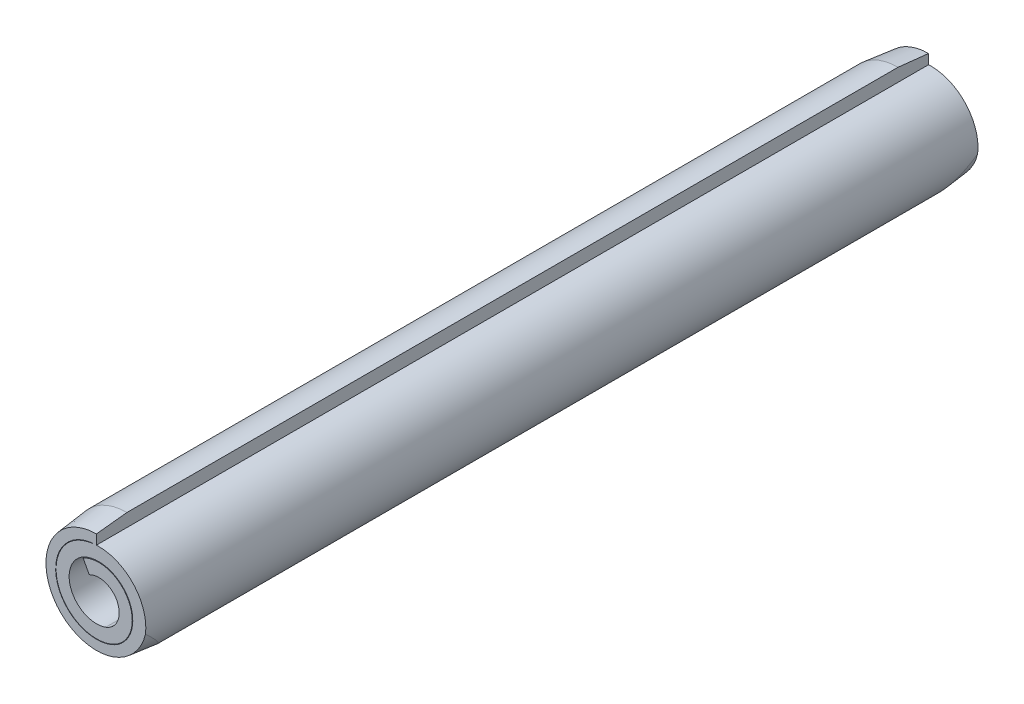
ISO-10303-21;
HEADER;
FILE_DESCRIPTION(('STEP AP214'),'2;1');
FILE_NAME('part.step','',(''),(''),'','','');
FILE_SCHEMA(('AUTOMOTIVE_DESIGN { 1 0 10303 214 1 1 1 1 }'));
ENDSEC;
DATA;
#1=APPLICATION_CONTEXT('core data for automotive mechanical design processes');
#2=APPLICATION_PROTOCOL_DEFINITION('international standard','automotive_design',2000,#1);
#3=PRODUCT_CONTEXT('',#1,'mechanical');
#4=PRODUCT('Part','Part','',(#3));
#5=PRODUCT_RELATED_PRODUCT_CATEGORY('part','',(#4));
#6=PRODUCT_DEFINITION_FORMATION('','',#4);
#7=PRODUCT_DEFINITION_CONTEXT('part definition',#1,'design');
#8=PRODUCT_DEFINITION('design','',#6,#7);
#9=PRODUCT_DEFINITION_SHAPE('','',#8);
#10=(LENGTH_UNIT() NAMED_UNIT(*) SI_UNIT(.MILLI.,.METRE.));
#11=(NAMED_UNIT(*) PLANE_ANGLE_UNIT() SI_UNIT($,.RADIAN.));
#12=(NAMED_UNIT(*) SI_UNIT($,.STERADIAN.) SOLID_ANGLE_UNIT());
#13=UNCERTAINTY_MEASURE_WITH_UNIT(LENGTH_MEASURE(1.E-05),#10,'distance_accuracy_value','');
#14=(GEOMETRIC_REPRESENTATION_CONTEXT(3) GLOBAL_UNCERTAINTY_ASSIGNED_CONTEXT((#13)) GLOBAL_UNIT_ASSIGNED_CONTEXT((#10,
#11,#12)) REPRESENTATION_CONTEXT('',''));
#15=CARTESIAN_POINT('',(0.,0.,0.));
#16=DIRECTION('',(0.,0.,1.));
#17=DIRECTION('',(1.,0.,0.));
#18=AXIS2_PLACEMENT_3D('',#15,#16,#17);
#19=CARTESIAN_POINT('',(0.107937422877879,-0.296555632071094,-19.05));
#20=DIRECTION('',(0.,0.,1.));
#21=DIRECTION('',(1.,0.,0.));
#22=AXIS2_PLACEMENT_3D('',#19,#20,#21);
#23=CYLINDRICAL_SURFACE('',#22,1.5322620880474);
#24=CARTESIAN_POINT('',(0.107937422877879,-0.296555632071094,19.05));
#25=DIRECTION('',(0.,0.,1.));
#26=DIRECTION('',(1.,0.,0.));
#27=AXIS2_PLACEMENT_3D('',#24,#25,#26);
#28=CIRCLE('',#27,1.5322620880474);
#29=CARTESIAN_POINT('',(0.632001921844338,-1.73641100931924,19.05));
#30=VERTEX_POINT('',#29);
#31=CARTESIAN_POINT('',(-0.610244184975722,1.05697393340141,19.05));
#32=VERTEX_POINT('',#31);
#33=EDGE_CURVE('E197',#30,#32,#28,.T.);
#34=ORIENTED_EDGE('',*,*,#33,.F.);
#35=DIRECTION('',(0.,0.,1.));
#36=VECTOR('',#35,1.);
#37=CARTESIAN_POINT('',(0.632001921844338,-1.73641100931924,-19.05));
#38=LINE('',#37,#36);
#39=CARTESIAN_POINT('',(0.632001921844338,-1.73641100931924,-19.05));
#40=VERTEX_POINT('',#39);
#41=EDGE_CURVE('E170',#40,#30,#38,.T.);
#42=ORIENTED_EDGE('',*,*,#41,.F.);
#43=CARTESIAN_POINT('',(0.107937422877879,-0.296555632071094,-19.05));
#44=DIRECTION('',(0.,0.,1.));
#45=DIRECTION('',(1.,0.,0.));
#46=AXIS2_PLACEMENT_3D('',#43,#44,#45);
#47=CIRCLE('',#46,1.5322620880474);
#48=CARTESIAN_POINT('',(-0.610244184975722,1.05697393340141,-19.05));
#49=VERTEX_POINT('',#48);
#50=EDGE_CURVE('E181',#40,#49,#47,.T.);
#51=ORIENTED_EDGE('',*,*,#50,.T.);
#52=DIRECTION('',(0.,0.,1.));
#53=VECTOR('',#52,1.);
#54=CARTESIAN_POINT('',(-0.610244184975722,1.05697393340141,-19.05));
#55=LINE('',#54,#53);
#56=EDGE_CURVE('E168',#49,#32,#55,.T.);
#57=ORIENTED_EDGE('',*,*,#56,.T.);
#58=EDGE_LOOP('',(#34,#42,#51,#57));
#59=FACE_BOUND('',#58,.T.);
#60=ADVANCED_FACE('F41',(#59),#23,.T.);
#61=CARTESIAN_POINT('',(0.,0.,-19.05));
#62=DIRECTION('',(0.,0.,1.));
#63=DIRECTION('',(1.,0.,0.));
#64=AXIS2_PLACEMENT_3D('',#61,#62,#63);
#65=CYLINDRICAL_SURFACE('',#64,1.84785);
#66=CARTESIAN_POINT('',(0.,0.,19.05));
#67=DIRECTION('',(0.,0.,1.));
#68=DIRECTION('',(1.,0.,0.));
#69=AXIS2_PLACEMENT_3D('',#66,#67,#68);
#70=CIRCLE('',#69,1.84785);
#71=CARTESIAN_POINT('',(-0.63200192184434,1.73641100931924,19.05));
#72=VERTEX_POINT('',#71);
#73=EDGE_CURVE('E178',#72,#30,#70,.T.);
#74=ORIENTED_EDGE('',*,*,#73,.F.);
#75=DIRECTION('',(0.,0.,1.));
#76=VECTOR('',#75,1.);
#77=CARTESIAN_POINT('',(-0.63200192184434,1.73641100931924,-19.05));
#78=LINE('',#77,#76);
#79=CARTESIAN_POINT('',(-0.63200192184434,1.73641100931924,-19.05));
#80=VERTEX_POINT('',#79);
#81=EDGE_CURVE('E150',#80,#72,#78,.T.);
#82=ORIENTED_EDGE('',*,*,#81,.F.);
#83=CARTESIAN_POINT('',(0.,0.,-19.05));
#84=DIRECTION('',(0.,0.,1.));
#85=DIRECTION('',(1.,0.,0.));
#86=AXIS2_PLACEMENT_3D('',#83,#84,#85);
#87=CIRCLE('',#86,1.84785);
#88=EDGE_CURVE('E169',#80,#40,#87,.T.);
#89=ORIENTED_EDGE('',*,*,#88,.T.);
#90=ORIENTED_EDGE('',*,*,#41,.T.);
#91=EDGE_LOOP('',(#74,#82,#89,#90));
#92=FACE_BOUND('',#91,.T.);
#93=ADVANCED_FACE('F243',(#92),#65,.T.);
#94=CARTESIAN_POINT('',(0.105333653640723,-0.28940183488654,-19.05));
#95=DIRECTION('',(0.,0.,1.));
#96=DIRECTION('',(1.,0.,0.));
#97=AXIS2_PLACEMENT_3D('',#94,#95,#96);
#98=CYLINDRICAL_SURFACE('',#97,2.155825);
#99=CARTESIAN_POINT('',(-0.730951402608285,-2.27641183368363,-18.3213688930322));
#100=CARTESIAN_POINT('',(-0.632038428762886,-2.31807056662797,-18.2351715536961));
#101=CARTESIAN_POINT('',(-0.525739077153384,-2.35405761316564,-18.1528513770389));
#102=CARTESIAN_POINT('',(-0.299197100204193,-2.41017944527057,-18.0007990504773));
#103=CARTESIAN_POINT('',(-0.178822664959334,-2.43014788046677,-17.9312046487274));
#104=CARTESIAN_POINT('',(0.0252857899694057,-2.44516405539726,-17.8341046888321));
#105=CARTESIAN_POINT('',(0.10564288765616,-2.44678359263239,-17.8006387941871));
#106=CARTESIAN_POINT('',(0.269020038345983,-2.44055014032401,-17.7430207144317));
#107=CARTESIAN_POINT('',(0.352028940727043,-2.43273274995162,-17.7188339777602));
#108=CARTESIAN_POINT('',(0.519608719985599,-2.40675680101304,-17.6810497510662));
#109=CARTESIAN_POINT('',(0.604186738903971,-2.3885177126992,-17.6675366981464));
#110=CARTESIAN_POINT('',(0.771549598273527,-2.34154358272134,-17.6525211586845));
#111=CARTESIAN_POINT('',(0.854333780427283,-2.31280475474724,-17.6510230093141));
#112=CARTESIAN_POINT('',(1.00962446812408,-2.24808245496467,-17.6598546862607));
#113=CARTESIAN_POINT('',(1.08244595844533,-2.21273607362977,-17.6693751164088));
#114=CARTESIAN_POINT('',(1.22217673541263,-2.13510945900045,-17.6982374019123));
#115=CARTESIAN_POINT('',(1.28908479964344,-2.09282779718942,-17.7175812824084));
#116=CARTESIAN_POINT('',(1.41759023505564,-2.00169430566362,-17.7655341409918));
#117=CARTESIAN_POINT('',(1.47898990079771,-1.9526932713999,-17.7943842482241));
#118=CARTESIAN_POINT('',(1.59385732472381,-1.85074244561496,-17.859644291212));
#119=CARTESIAN_POINT('',(1.64732581309859,-1.7977930182813,-17.896053530288));
#120=CARTESIAN_POINT('',(1.77543509311488,-1.65757513345177,-17.9981024864401));
#121=CARTESIAN_POINT('',(1.8442046940896,-1.56832312690964,-18.0683951916449));
#122=CARTESIAN_POINT('',(1.96418146725999,-1.38676875550695,-18.2201610548878));
#123=CARTESIAN_POINT('',(2.01527446516042,-1.29445063222551,-18.3017023074054));
#124=CARTESIAN_POINT('',(2.09100544976458,-1.13236920932358,-18.4514062420433));
#125=CARTESIAN_POINT('',(2.11905902520044,-1.06263728869842,-18.5179335242678));
#126=CARTESIAN_POINT('',(2.16706898776063,-0.923627132451416,-18.6544350426262));
#127=CARTESIAN_POINT('',(2.18701664017665,-0.854349464962969,-18.7244129064686));
#128=CARTESIAN_POINT('',(2.21926514952873,-0.718006498387684,-18.8657297582222));
#129=CARTESIAN_POINT('',(2.23169367807751,-0.650923697969956,-18.9370235167629));
#130=CARTESIAN_POINT('',(2.25002249424984,-0.518191301242313,-19.0814280972974));
#131=CARTESIAN_POINT('',(2.25593916520007,-0.452538517383224,-19.1545338838157));
#132=CARTESIAN_POINT('',(2.25891828598306,-0.387659974314905,-19.2283771044082));
#133=B_SPLINE_CURVE_WITH_KNOTS('',3,(#99,#100,#101,#102,#103,#104,#105,#106,#107,#108,#109,#110,
#111,#112,#113,#114,#115,#116,#117,#118,#119,#120,#121,#122,#123,#124,#125,#126,#127,#128,#129,
#130,#131,#132),.UNSPECIFIED.,.F.,.F.,(4,2,2,2,2,2,2,2,2,2,2,2,2,2,2,2,4),(0.,0.414511314279441,
0.833273463477767,1.09353254933765,1.35281291339116,1.61412439865845,1.87553020859357,
2.11889005301944,2.3623000873616,2.61243262895452,2.86254212756454,3.25871597933673,
3.6574029543513,3.95813265379668,4.25918555698782,4.55497169543045,4.8500119456586),.UNSPECIFIED.);
#134=CARTESIAN_POINT('',(2.24568423018674,-0.547240621930231,-19.05));
#135=VERTEX_POINT('',#134);
#136=CARTESIAN_POINT('',(0.842669229125781,-2.31521467909232,-17.653));
#137=VERTEX_POINT('',#136);
#138=EDGE_CURVE('E130',#135,#137,#133,.F.);
#139=ORIENTED_EDGE('',*,*,#138,.F.);
#140=CARTESIAN_POINT('',(0.105333653640723,-0.28940183488654,-19.05));
#141=DIRECTION('',(0.,0.,1.));
#142=DIRECTION('',(1.,0.,0.));
#143=AXIS2_PLACEMENT_3D('',#140,#141,#142);
#144=CIRCLE('',#143,2.155825);
#145=EDGE_CURVE('E201',#135,#80,#144,.T.);
#146=ORIENTED_EDGE('',*,*,#145,.T.);
#147=ORIENTED_EDGE('',*,*,#81,.T.);
#148=CARTESIAN_POINT('',(0.105333653640723,-0.28940183488654,19.05));
#149=DIRECTION('',(0.,0.,1.));
#150=DIRECTION('',(1.,0.,0.));
#151=AXIS2_PLACEMENT_3D('',#148,#149,#150);
#152=CIRCLE('',#151,2.155825);
#153=CARTESIAN_POINT('',(2.24568423018673,-0.547240621930278,19.05));
#154=VERTEX_POINT('',#153);
#155=EDGE_CURVE('E182',#154,#72,#152,.T.);
#156=ORIENTED_EDGE('',*,*,#155,.F.);
#157=CARTESIAN_POINT('',(-0.730951402608253,-2.27641183368364,18.3213688930322));
#158=CARTESIAN_POINT('',(-0.632038428762855,-2.31807056662798,18.2351715536962));
#159=CARTESIAN_POINT('',(-0.525739077153354,-2.35405761316565,18.1528513770389));
#160=CARTESIAN_POINT('',(-0.299197100204162,-2.41017944527057,18.0007990504773));
#161=CARTESIAN_POINT('',(-0.178822664959303,-2.43014788046678,17.9312046487275));
#162=CARTESIAN_POINT('',(0.0252857899694354,-2.44516405539726,17.8341046888322));
#163=CARTESIAN_POINT('',(0.105642887656189,-2.44678359263239,17.8006387941871));
#164=CARTESIAN_POINT('',(0.269020038346008,-2.440550140324,17.7430207144318));
#165=CARTESIAN_POINT('',(0.352028940727067,-2.43273274995162,17.7188339777603));
#166=CARTESIAN_POINT('',(0.519608719985619,-2.40675680101303,17.6810497510663));
#167=CARTESIAN_POINT('',(0.604186738903988,-2.3885177126992,17.6675366981465));
#168=CARTESIAN_POINT('',(0.77154959827354,-2.34154358272133,17.6525211586845));
#169=CARTESIAN_POINT('',(0.854333780427294,-2.31280475474724,17.6510230093142));
#170=CARTESIAN_POINT('',(1.00962446812409,-2.24808245496466,17.6598546862607));
#171=CARTESIAN_POINT('',(1.08244595844533,-2.21273607362977,17.6693751164089));
#172=CARTESIAN_POINT('',(1.22217673541263,-2.13510945900045,17.6982374019123));
#173=CARTESIAN_POINT('',(1.28908479964344,-2.09282779718942,17.7175812824085));
#174=CARTESIAN_POINT('',(1.41759023505564,-2.00169430566362,17.7655341409919));
#175=CARTESIAN_POINT('',(1.47898990079771,-1.95269327139991,17.7943842482242));
#176=CARTESIAN_POINT('',(1.59385732472381,-1.85074244561496,17.859644291212));
#177=CARTESIAN_POINT('',(1.64732581309859,-1.7977930182813,17.896053530288));
#178=CARTESIAN_POINT('',(1.77543509311487,-1.65757513345178,17.9981024864402));
#179=CARTESIAN_POINT('',(1.8442046940896,-1.56832312690964,18.068395191645));
#180=CARTESIAN_POINT('',(1.96418146725998,-1.38676875550696,18.2201610548878));
#181=CARTESIAN_POINT('',(2.01527446516041,-1.29445063222552,18.3017023074054));
#182=CARTESIAN_POINT('',(2.09100544976457,-1.13236920932359,18.4514062420433));
#183=CARTESIAN_POINT('',(2.11905902520043,-1.06263728869843,18.5179335242678));
#184=CARTESIAN_POINT('',(2.16706898776063,-0.92362713245143,18.6544350426263));
#185=CARTESIAN_POINT('',(2.18701664017665,-0.854349464962984,18.7244129064687));
#186=CARTESIAN_POINT('',(2.21926514952872,-0.718006498387699,18.8657297582223));
#187=CARTESIAN_POINT('',(2.23169367807751,-0.65092369796997,18.9370235167629));
#188=CARTESIAN_POINT('',(2.25002249424984,-0.518191301242327,19.0814280972974));
#189=CARTESIAN_POINT('',(2.25593916520007,-0.45253851738324,19.1545338838158));
#190=CARTESIAN_POINT('',(2.25891828598306,-0.387659974314923,19.2283771044082));
#191=B_SPLINE_CURVE_WITH_KNOTS('',3,(#157,#158,#159,#160,#161,#162,#163,#164,#165,#166,#167,
#168,#169,#170,#171,#172,#173,#174,#175,#176,#177,#178,#179,#180,#181,#182,#183,#184,#185,#186,
#187,#188,#189,#190),.UNSPECIFIED.,.F.,.F.,(4,2,2,2,2,2,2,2,2,2,2,2,2,2,2,2,4),(0.,
0.414511314279435,0.833273463477757,1.09353254933764,1.35281291339114,1.61412439865842,
1.87553020859354,2.11889005301941,2.36230008736156,2.61243262895447,2.86254212756448,
3.25871597933667,3.65740295435123,3.95813265379661,4.25918555698775,4.55497169543037,
4.85001194565852),.UNSPECIFIED.);
#192=CARTESIAN_POINT('',(0.842669229125784,-2.31521467909232,17.653));
#193=VERTEX_POINT('',#192);
#194=EDGE_CURVE('E62',#193,#154,#191,.T.);
#195=ORIENTED_EDGE('',*,*,#194,.F.);
#196=DIRECTION('',(0.,0.,1.));
#197=VECTOR('',#196,1.);
#198=CARTESIAN_POINT('',(0.842669229125783,-2.31521467909232,-19.05));
#199=LINE('',#198,#197);
#200=EDGE_CURVE('E147',#137,#193,#199,.T.);
#201=ORIENTED_EDGE('',*,*,#200,.F.);
#202=EDGE_LOOP('',(#139,#146,#147,#156,#195,#201));
#203=FACE_BOUND('',#202,.T.);
#204=ADVANCED_FACE('F225',(#203),#98,.T.);
#205=CARTESIAN_POINT('',(0.,0.,-19.05));
#206=DIRECTION('',(0.,0.,1.));
#207=DIRECTION('',(1.,0.,0.));
#208=AXIS2_PLACEMENT_3D('',#205,#206,#207);
#209=CYLINDRICAL_SURFACE('',#208,2.4638);
#210=CARTESIAN_POINT('',(0.,0.,-17.653));
#211=DIRECTION('',(0.,0.,-1.));
#212=DIRECTION('',(0.,1.,0.));
#213=AXIS2_PLACEMENT_3D('',#210,#211,#212);
#214=CIRCLE('',#213,2.4638);
#215=CARTESIAN_POINT('',(0.,2.4638,-17.653));
#216=VERTEX_POINT('',#215);
#217=EDGE_CURVE('E127',#137,#216,#214,.T.);
#218=ORIENTED_EDGE('',*,*,#217,.F.);
#219=ORIENTED_EDGE('',*,*,#200,.T.);
#220=CARTESIAN_POINT('',(0.,0.,17.653));
#221=DIRECTION('',(0.,0.,-1.));
#222=DIRECTION('',(0.,1.,0.));
#223=AXIS2_PLACEMENT_3D('',#220,#221,#222);
#224=CIRCLE('',#223,2.4638);
#225=CARTESIAN_POINT('',(0.,2.4638,17.653));
#226=VERTEX_POINT('',#225);
#227=EDGE_CURVE('E146',#193,#226,#224,.T.);
#228=ORIENTED_EDGE('',*,*,#227,.T.);
#229=DIRECTION('',(0.,0.,1.));
#230=VECTOR('',#229,1.);
#231=CARTESIAN_POINT('',(0.,2.4638,-19.05));
#232=LINE('',#231,#230);
#233=EDGE_CURVE('E139',#216,#226,#232,.T.);
#234=ORIENTED_EDGE('',*,*,#233,.F.);
#235=EDGE_LOOP('',(#218,#219,#228,#234));
#236=FACE_BOUND('',#235,.T.);
#237=ADVANCED_FACE('F145',(#236),#209,.T.);
#238=CARTESIAN_POINT('',(0.,2.4638,-19.05));
#239=DIRECTION('',(-1.,0.,0.));
#240=DIRECTION('',(0.,-1.,0.));
#241=AXIS2_PLACEMENT_3D('',#238,#239,#240);
#242=PLANE('',#241);
#243=DIRECTION('',(0.,-1.,0.));
#244=VECTOR('',#243,1.);
#245=CARTESIAN_POINT('',(0.,2.4638,-19.05));
#246=LINE('',#245,#244);
#247=CARTESIAN_POINT('',(0.,2.3114,-19.05));
#248=VERTEX_POINT('',#247);
#249=CARTESIAN_POINT('',(0.,1.8663285,-19.05));
#250=VERTEX_POINT('',#249);
#251=EDGE_CURVE('E142',#248,#250,#246,.T.);
#252=ORIENTED_EDGE('',*,*,#251,.F.);
#253=DIRECTION('',(0.,-0.108447510175418,-0.994102176607995));
#254=VECTOR('',#253,1.);
#255=CARTESIAN_POINT('',(0.,0.,-40.2378333333331));
#256=LINE('',#255,#254);
#257=EDGE_CURVE('E55',#248,#216,#256,.F.);
#258=ORIENTED_EDGE('',*,*,#257,.T.);
#259=ORIENTED_EDGE('',*,*,#233,.T.);
#260=DIRECTION('',(0.,0.108447510175419,-0.994102176607995));
#261=VECTOR('',#260,1.);
#262=CARTESIAN_POINT('',(0.,0.,40.2378333333331));
#263=LINE('',#262,#261);
#264=CARTESIAN_POINT('',(0.,2.3114,19.05));
#265=VERTEX_POINT('',#264);
#266=EDGE_CURVE('E223',#226,#265,#263,.F.);
#267=ORIENTED_EDGE('',*,*,#266,.T.);
#268=DIRECTION('',(0.,-1.,0.));
#269=VECTOR('',#268,1.);
#270=CARTESIAN_POINT('',(0.,2.4638,19.05));
#271=LINE('',#270,#269);
#272=CARTESIAN_POINT('',(0.,1.8663285,19.05));
#273=VERTEX_POINT('',#272);
#274=EDGE_CURVE('E184',#265,#273,#271,.T.);
#275=ORIENTED_EDGE('',*,*,#274,.T.);
#276=DIRECTION('',(0.,0.,1.));
#277=VECTOR('',#276,1.);
#278=CARTESIAN_POINT('',(0.,1.8663285,-19.05));
#279=LINE('',#278,#277);
#280=EDGE_CURVE('E148',#250,#273,#279,.T.);
#281=ORIENTED_EDGE('',*,*,#280,.F.);
#282=EDGE_LOOP('',(#252,#258,#259,#267,#275,#281));
#283=FACE_BOUND('',#282,.T.);
#284=ADVANCED_FACE('F137',(#283),#242,.F.);
#285=CARTESIAN_POINT('',(0.,0.,-19.05));
#286=DIRECTION('',(0.,0.,1.));
#287=DIRECTION('',(1.,0.,0.));
#288=AXIS2_PLACEMENT_3D('',#285,#286,#287);
#289=CYLINDRICAL_SURFACE('',#288,1.8663285);
#290=CARTESIAN_POINT('',(0.,0.,19.05));
#291=DIRECTION('',(0.,0.,1.));
#292=DIRECTION('',(1.,0.,0.));
#293=AXIS2_PLACEMENT_3D('',#290,#291,#292);
#294=CIRCLE('',#293,1.8663285);
#295=CARTESIAN_POINT('',(0.638321941062782,-1.75377511941243,19.05));
#296=VERTEX_POINT('',#295);
#297=EDGE_CURVE('E186',#273,#296,#294,.T.);
#298=ORIENTED_EDGE('',*,*,#297,.T.);
#299=DIRECTION('',(0.,0.,1.));
#300=VECTOR('',#299,1.);
#301=CARTESIAN_POINT('',(0.638321941062782,-1.75377511941243,-19.05));
#302=LINE('',#301,#300);
#303=CARTESIAN_POINT('',(0.638321941062782,-1.75377511941243,-19.05));
#304=VERTEX_POINT('',#303);
#305=EDGE_CURVE('E153',#304,#296,#302,.T.);
#306=ORIENTED_EDGE('',*,*,#305,.F.);
#307=CARTESIAN_POINT('',(0.,0.,-19.05));
#308=DIRECTION('',(0.,0.,1.));
#309=DIRECTION('',(1.,0.,0.));
#310=AXIS2_PLACEMENT_3D('',#307,#308,#309);
#311=CIRCLE('',#310,1.8663285);
#312=EDGE_CURVE('E204',#250,#304,#311,.T.);
#313=ORIENTED_EDGE('',*,*,#312,.F.);
#314=ORIENTED_EDGE('',*,*,#280,.T.);
#315=EDGE_LOOP('',(#298,#306,#313,#314));
#316=FACE_BOUND('',#315,.T.);
#317=ADVANCED_FACE('F280',(#316),#289,.F.);
#318=CARTESIAN_POINT('',(0.105333653640723,-0.28940183488654,-19.05));
#319=DIRECTION('',(0.,0.,1.));
#320=DIRECTION('',(1.,0.,0.));
#321=AXIS2_PLACEMENT_3D('',#318,#319,#320);
#322=CYLINDRICAL_SURFACE('',#321,1.5583535);
#323=CARTESIAN_POINT('',(0.105333653640723,-0.28940183488654,19.05));
#324=DIRECTION('',(0.,0.,1.));
#325=DIRECTION('',(1.,0.,0.));
#326=AXIS2_PLACEMENT_3D('',#323,#324,#325);
#327=CIRCLE('',#326,1.5583535);
#328=CARTESIAN_POINT('',(-0.427654633781337,1.17497144963935,19.05));
#329=VERTEX_POINT('',#328);
#330=EDGE_CURVE('E188',#296,#329,#327,.T.);
#331=ORIENTED_EDGE('',*,*,#330,.T.);
#332=DIRECTION('',(0.,0.,1.));
#333=VECTOR('',#332,1.);
#334=CARTESIAN_POINT('',(-0.427654633781337,1.17497144963935,-19.05));
#335=LINE('',#334,#333);
#336=CARTESIAN_POINT('',(-0.427654633781337,1.17497144963935,-19.05));
#337=VERTEX_POINT('',#336);
#338=EDGE_CURVE('E159',#337,#329,#335,.T.);
#339=ORIENTED_EDGE('',*,*,#338,.F.);
#340=CARTESIAN_POINT('',(0.105333653640723,-0.28940183488654,-19.05));
#341=DIRECTION('',(0.,0.,1.));
#342=DIRECTION('',(1.,0.,0.));
#343=AXIS2_PLACEMENT_3D('',#340,#341,#342);
#344=CIRCLE('',#343,1.5583535);
#345=EDGE_CURVE('E206',#304,#337,#344,.T.);
#346=ORIENTED_EDGE('',*,*,#345,.F.);
#347=ORIENTED_EDGE('',*,*,#305,.T.);
#348=EDGE_LOOP('',(#331,#339,#346,#347));
#349=FACE_BOUND('',#348,.T.);
#350=ADVANCED_FACE('F276',(#349),#322,.F.);
#351=CARTESIAN_POINT('',(0.,0.,-19.05));
#352=DIRECTION('',(0.,0.,1.));
#353=DIRECTION('',(1.,0.,0.));
#354=AXIS2_PLACEMENT_3D('',#351,#352,#353);
#355=CYLINDRICAL_SURFACE('',#354,1.2503785);
#356=CARTESIAN_POINT('',(0.,0.,19.05));
#357=DIRECTION('',(0.,0.,1.));
#358=DIRECTION('',(1.,0.,0.));
#359=AXIS2_PLACEMENT_3D('',#356,#357,#358);
#360=CIRCLE('',#359,1.2503785);
#361=CARTESIAN_POINT('',(0.427654633781335,-1.17497144963935,19.05));
#362=VERTEX_POINT('',#361);
#363=EDGE_CURVE('E190',#329,#362,#360,.T.);
#364=ORIENTED_EDGE('',*,*,#363,.T.);
#365=DIRECTION('',(0.,0.,1.));
#366=VECTOR('',#365,1.);
#367=CARTESIAN_POINT('',(0.427654633781335,-1.17497144963935,-19.05));
#368=LINE('',#367,#366);
#369=CARTESIAN_POINT('',(0.427654633781335,-1.17497144963935,-19.05));
#370=VERTEX_POINT('',#369);
#371=EDGE_CURVE('E162',#370,#362,#368,.T.);
#372=ORIENTED_EDGE('',*,*,#371,.F.);
#373=CARTESIAN_POINT('',(0.,0.,-19.05));
#374=DIRECTION('',(0.,0.,1.));
#375=DIRECTION('',(1.,0.,0.));
#376=AXIS2_PLACEMENT_3D('',#373,#374,#375);
#377=CIRCLE('',#376,1.2503785);
#378=EDGE_CURVE('E208',#337,#370,#377,.T.);
#379=ORIENTED_EDGE('',*,*,#378,.F.);
#380=ORIENTED_EDGE('',*,*,#338,.T.);
#381=EDGE_LOOP('',(#364,#372,#379,#380));
#382=FACE_BOUND('',#381,.T.);
#383=ADVANCED_FACE('F272',(#382),#355,.F.);
#384=CARTESIAN_POINT('',(0.107937422877879,-0.296555632071094,-19.05));
#385=DIRECTION('',(0.,0.,1.));
#386=DIRECTION('',(1.,0.,0.));
#387=AXIS2_PLACEMENT_3D('',#384,#385,#386);
#388=CYLINDRICAL_SURFACE('',#387,0.934790588047396);
#389=CARTESIAN_POINT('',(0.107937422877879,-0.296555632071094,19.05));
#390=DIRECTION('',(0.,0.,1.));
#391=DIRECTION('',(1.,0.,0.));
#392=AXIS2_PLACEMENT_3D('',#389,#390,#391);
#393=CIRCLE('',#392,0.934790588047396);
#394=CARTESIAN_POINT('',(-0.330205250472351,0.529195202800727,19.05));
#395=VERTEX_POINT('',#394);
#396=EDGE_CURVE('E192',#362,#395,#393,.T.);
#397=ORIENTED_EDGE('',*,*,#396,.T.);
#398=DIRECTION('',(0.,0.,1.));
#399=VECTOR('',#398,1.);
#400=CARTESIAN_POINT('',(-0.330205250472351,0.529195202800727,-19.05));
#401=LINE('',#400,#399);
#402=CARTESIAN_POINT('',(-0.330205250472351,0.529195202800727,-19.05));
#403=VERTEX_POINT('',#402);
#404=EDGE_CURVE('E165',#403,#395,#401,.T.);
#405=ORIENTED_EDGE('',*,*,#404,.F.);
#406=CARTESIAN_POINT('',(0.107937422877879,-0.296555632071094,-19.05));
#407=DIRECTION('',(0.,0.,1.));
#408=DIRECTION('',(1.,0.,0.));
#409=AXIS2_PLACEMENT_3D('',#406,#407,#408);
#410=CIRCLE('',#409,0.934790588047396);
#411=EDGE_CURVE('E210',#370,#403,#410,.T.);
#412=ORIENTED_EDGE('',*,*,#411,.F.);
#413=ORIENTED_EDGE('',*,*,#371,.T.);
#414=EDGE_LOOP('',(#397,#405,#412,#413));
#415=FACE_BOUND('',#414,.T.);
#416=ADVANCED_FACE('F267',(#415),#388,.F.);
#417=CARTESIAN_POINT('',(-0.330205250472351,0.529195202800727,-19.05));
#418=DIRECTION('',(0.883353817881994,0.468706765935062,0.));
#419=DIRECTION('',(-0.468706765935062,0.883353817881994,0.));
#420=AXIS2_PLACEMENT_3D('',#417,#418,#419);
#421=PLANE('',#420);
#422=DIRECTION('',(-0.468706765935062,0.883353817881994,0.));
#423=VECTOR('',#422,1.);
#424=CARTESIAN_POINT('',(-0.330205250472351,0.529195202800727,19.05));
#425=LINE('',#424,#423);
#426=EDGE_CURVE('E194',#395,#32,#425,.T.);
#427=ORIENTED_EDGE('',*,*,#426,.T.);
#428=ORIENTED_EDGE('',*,*,#56,.F.);
#429=DIRECTION('',(-0.468706765935062,0.883353817881994,0.));
#430=VECTOR('',#429,1.);
#431=CARTESIAN_POINT('',(-0.330205250472351,0.529195202800727,-19.05));
#432=LINE('',#431,#430);
#433=EDGE_CURVE('E212',#403,#49,#432,.T.);
#434=ORIENTED_EDGE('',*,*,#433,.F.);
#435=ORIENTED_EDGE('',*,*,#404,.T.);
#436=EDGE_LOOP('',(#427,#428,#434,#435));
#437=FACE_BOUND('',#436,.T.);
#438=ADVANCED_FACE('F239',(#437),#421,.F.);
#439=CARTESIAN_POINT('',(0.107937422877879,-0.296555632071094,-19.05));
#440=DIRECTION('',(0.,0.,1.));
#441=DIRECTION('',(1.,0.,0.));
#442=AXIS2_PLACEMENT_3D('',#439,#440,#441);
#443=PLANE('',#442);
#444=ORIENTED_EDGE('',*,*,#145,.F.);
#445=CARTESIAN_POINT('',(0.,0.,-19.05));
#446=DIRECTION('',(0.,0.,1.));
#447=DIRECTION('',(1.,0.,0.));
#448=AXIS2_PLACEMENT_3D('',#445,#446,#447);
#449=CIRCLE('',#448,2.3114);
#450=EDGE_CURVE('E11',#135,#248,#449,.F.);
#451=ORIENTED_EDGE('',*,*,#450,.T.);
#452=ORIENTED_EDGE('',*,*,#251,.T.);
#453=ORIENTED_EDGE('',*,*,#312,.T.);
#454=ORIENTED_EDGE('',*,*,#345,.T.);
#455=ORIENTED_EDGE('',*,*,#378,.T.);
#456=ORIENTED_EDGE('',*,*,#411,.T.);
#457=ORIENTED_EDGE('',*,*,#433,.T.);
#458=ORIENTED_EDGE('',*,*,#50,.F.);
#459=ORIENTED_EDGE('',*,*,#88,.F.);
#460=EDGE_LOOP('',(#444,#451,#452,#453,#454,#455,#456,#457,#458,#459));
#461=FACE_BOUND('',#460,.T.);
#462=ADVANCED_FACE('F236',(#461),#443,.F.);
#463=CARTESIAN_POINT('',(0.107937422877879,-0.296555632071094,19.05));
#464=DIRECTION('',(0.,0.,1.));
#465=DIRECTION('',(1.,0.,0.));
#466=AXIS2_PLACEMENT_3D('',#463,#464,#465);
#467=PLANE('',#466);
#468=CARTESIAN_POINT('',(0.,0.,19.05));
#469=DIRECTION('',(0.,0.,1.));
#470=DIRECTION('',(1.,0.,0.));
#471=AXIS2_PLACEMENT_3D('',#468,#469,#470);
#472=CIRCLE('',#471,2.3114);
#473=EDGE_CURVE('E48',#154,#265,#472,.F.);
#474=ORIENTED_EDGE('',*,*,#473,.F.);
#475=ORIENTED_EDGE('',*,*,#155,.T.);
#476=ORIENTED_EDGE('',*,*,#73,.T.);
#477=ORIENTED_EDGE('',*,*,#33,.T.);
#478=ORIENTED_EDGE('',*,*,#426,.F.);
#479=ORIENTED_EDGE('',*,*,#396,.F.);
#480=ORIENTED_EDGE('',*,*,#363,.F.);
#481=ORIENTED_EDGE('',*,*,#330,.F.);
#482=ORIENTED_EDGE('',*,*,#297,.F.);
#483=ORIENTED_EDGE('',*,*,#274,.F.);
#484=EDGE_LOOP('',(#474,#475,#476,#477,#478,#479,#480,#481,#482,#483));
#485=FACE_BOUND('',#484,.T.);
#486=ADVANCED_FACE('F234',(#485),#467,.T.);
#487=CARTESIAN_POINT('',(0.,0.,19.05));
#488=DIRECTION('',(0.,0.,-1.));
#489=DIRECTION('',(0.,1.,0.));
#490=AXIS2_PLACEMENT_3D('',#487,#488,#489);
#491=CONICAL_SURFACE('',#490,2.3114,0.108661215840589);
#492=ORIENTED_EDGE('',*,*,#194,.T.);
#493=ORIENTED_EDGE('',*,*,#473,.T.);
#494=ORIENTED_EDGE('',*,*,#266,.F.);
#495=ORIENTED_EDGE('',*,*,#227,.F.);
#496=EDGE_LOOP('',(#492,#493,#494,#495));
#497=FACE_BOUND('',#496,.T.);
#498=ADVANCED_FACE('F229',(#497),#491,.T.);
#499=CARTESIAN_POINT('',(0.,0.,-17.653));
#500=DIRECTION('',(0.,0.,1.));
#501=DIRECTION('',(0.,-1.,0.));
#502=AXIS2_PLACEMENT_3D('',#499,#500,#501);
#503=CONICAL_SURFACE('',#502,2.4638,0.108661215840589);
#504=ORIENTED_EDGE('',*,*,#138,.T.);
#505=ORIENTED_EDGE('',*,*,#217,.T.);
#506=ORIENTED_EDGE('',*,*,#257,.F.);
#507=ORIENTED_EDGE('',*,*,#450,.F.);
#508=EDGE_LOOP('',(#504,#505,#506,#507));
#509=FACE_BOUND('',#508,.T.);
#510=ADVANCED_FACE('F128',(#509),#503,.T.);
#511=CLOSED_SHELL('',(#60,#93,#204,#237,#284,#317,#350,#383,#416,#438,#462,#486,#498,#510));
#512=MANIFOLD_SOLID_BREP('B2',#511);
#513=ADVANCED_BREP_SHAPE_REPRESENTATION('',(#18,#512),#14);
#514=SHAPE_DEFINITION_REPRESENTATION(#9,#513);
ENDSEC;
END-ISO-10303-21;
